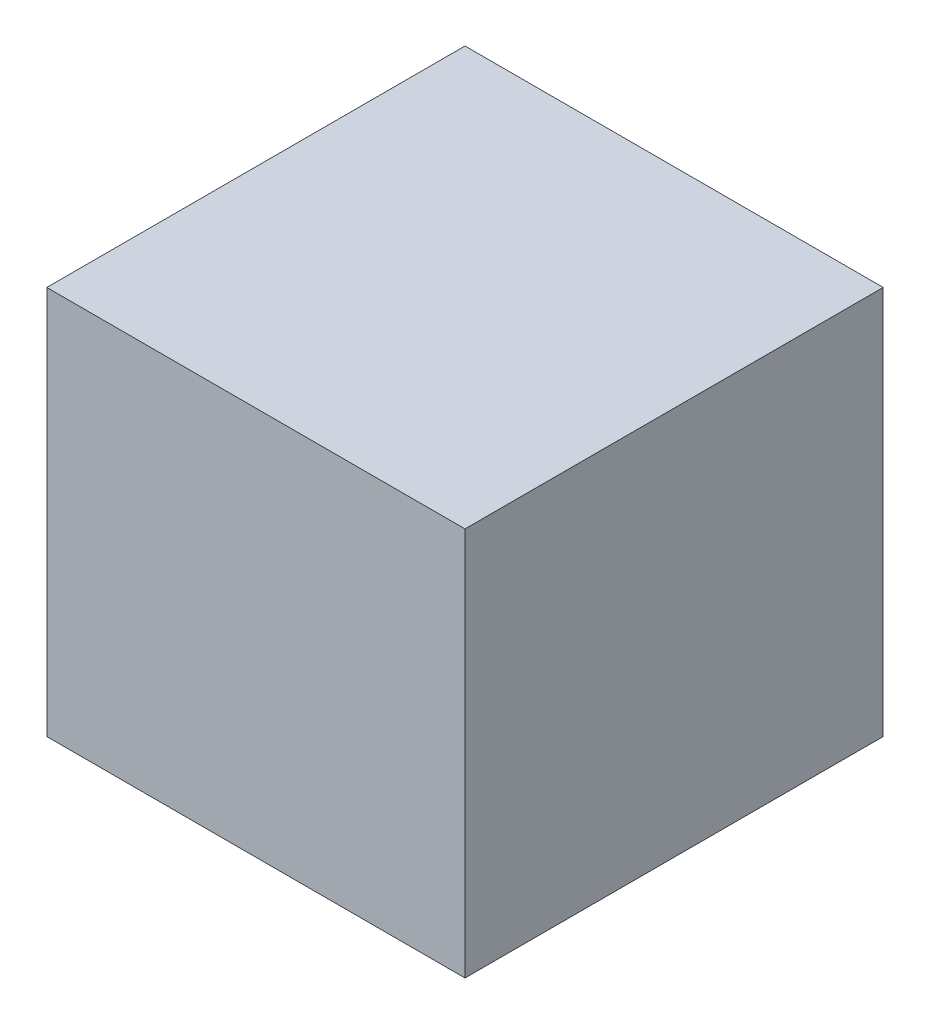
ISO-10303-21;
HEADER;
FILE_DESCRIPTION(('STEP AP214'),'2;1');
FILE_NAME('part.step','',(''),(''),'','','');
FILE_SCHEMA(('AUTOMOTIVE_DESIGN { 1 0 10303 214 1 1 1 1 }'));
ENDSEC;
DATA;
#1=APPLICATION_CONTEXT('core data for automotive mechanical design processes');
#2=APPLICATION_PROTOCOL_DEFINITION('international standard','automotive_design',2000,#1);
#3=PRODUCT_CONTEXT('',#1,'mechanical');
#4=PRODUCT('Part','Part','',(#3));
#5=PRODUCT_RELATED_PRODUCT_CATEGORY('part','',(#4));
#6=PRODUCT_DEFINITION_FORMATION('','',#4);
#7=PRODUCT_DEFINITION_CONTEXT('part definition',#1,'design');
#8=PRODUCT_DEFINITION('design','',#6,#7);
#9=PRODUCT_DEFINITION_SHAPE('','',#8);
#10=(LENGTH_UNIT() NAMED_UNIT(*) SI_UNIT(.MILLI.,.METRE.));
#11=(NAMED_UNIT(*) PLANE_ANGLE_UNIT() SI_UNIT($,.RADIAN.));
#12=(NAMED_UNIT(*) SI_UNIT($,.STERADIAN.) SOLID_ANGLE_UNIT());
#13=UNCERTAINTY_MEASURE_WITH_UNIT(LENGTH_MEASURE(1.E-05),#10,'distance_accuracy_value','');
#14=(GEOMETRIC_REPRESENTATION_CONTEXT(3) GLOBAL_UNCERTAINTY_ASSIGNED_CONTEXT((#13)) GLOBAL_UNIT_ASSIGNED_CONTEXT((#10,
#11,#12)) REPRESENTATION_CONTEXT('',''));
#15=CARTESIAN_POINT('',(0.,0.,0.));
#16=DIRECTION('',(0.,0.,1.));
#17=DIRECTION('',(1.,0.,0.));
#18=AXIS2_PLACEMENT_3D('',#15,#16,#17);
#19=CARTESIAN_POINT('',(0.,3.,0.));
#20=DIRECTION('',(0.,0.,-1.));
#21=DIRECTION('',(-1.,0.,0.));
#22=AXIS2_PLACEMENT_3D('',#19,#20,#21);
#23=PLANE('',#22);
#24=DIRECTION('',(0.,-1.,0.));
#25=VECTOR('',#24,1.);
#26=CARTESIAN_POINT('',(100.,3.,0.));
#27=LINE('',#26,#25);
#28=CARTESIAN_POINT('',(100.,3.,0.));
#29=VERTEX_POINT('',#28);
#30=CARTESIAN_POINT('',(100.,-90.,0.));
#31=VERTEX_POINT('',#30);
#32=EDGE_CURVE('E38',#29,#31,#27,.T.);
#33=ORIENTED_EDGE('',*,*,#32,.T.);
#34=DIRECTION('',(-1.,0.,0.));
#35=VECTOR('',#34,1.);
#36=CARTESIAN_POINT('',(0.,-90.,0.));
#37=LINE('',#36,#35);
#38=CARTESIAN_POINT('',(0.,-90.,0.));
#39=VERTEX_POINT('',#38);
#40=EDGE_CURVE('E148',#31,#39,#37,.T.);
#41=ORIENTED_EDGE('',*,*,#40,.T.);
#42=DIRECTION('',(0.,-1.,0.));
#43=VECTOR('',#42,1.);
#44=CARTESIAN_POINT('',(0.,3.,0.));
#45=LINE('',#44,#43);
#46=CARTESIAN_POINT('',(0.,3.,0.));
#47=VERTEX_POINT('',#46);
#48=EDGE_CURVE('E11',#47,#39,#45,.T.);
#49=ORIENTED_EDGE('',*,*,#48,.F.);
#50=DIRECTION('',(1.,0.,0.));
#51=VECTOR('',#50,1.);
#52=CARTESIAN_POINT('',(0.,3.,0.));
#53=LINE('',#52,#51);
#54=EDGE_CURVE('E150',#47,#29,#53,.T.);
#55=ORIENTED_EDGE('',*,*,#54,.T.);
#56=EDGE_LOOP('',(#33,#41,#49,#55));
#57=FACE_BOUND('',#56,.T.);
#58=ADVANCED_FACE('F35',(#57),#23,.T.);
#59=CARTESIAN_POINT('',(0.,3.,0.));
#60=DIRECTION('',(1.,0.,0.));
#61=DIRECTION('',(0.,0.,-1.));
#62=AXIS2_PLACEMENT_3D('',#59,#60,#61);
#63=PLANE('',#62);
#64=ORIENTED_EDGE('',*,*,#48,.T.);
#65=DIRECTION('',(0.,0.,1.));
#66=VECTOR('',#65,1.);
#67=CARTESIAN_POINT('',(0.,-90.,0.));
#68=LINE('',#67,#66);
#69=CARTESIAN_POINT('',(0.,-90.,100.));
#70=VERTEX_POINT('',#69);
#71=EDGE_CURVE('E136',#39,#70,#68,.T.);
#72=ORIENTED_EDGE('',*,*,#71,.T.);
#73=DIRECTION('',(0.,-1.,0.));
#74=VECTOR('',#73,1.);
#75=CARTESIAN_POINT('',(0.,3.,100.));
#76=LINE('',#75,#74);
#77=CARTESIAN_POINT('',(0.,3.,100.));
#78=VERTEX_POINT('',#77);
#79=EDGE_CURVE('E43',#78,#70,#76,.T.);
#80=ORIENTED_EDGE('',*,*,#79,.F.);
#81=DIRECTION('',(0.,0.,1.));
#82=VECTOR('',#81,1.);
#83=CARTESIAN_POINT('',(0.,3.,0.));
#84=LINE('',#83,#82);
#85=EDGE_CURVE('E157',#47,#78,#84,.T.);
#86=ORIENTED_EDGE('',*,*,#85,.F.);
#87=EDGE_LOOP('',(#64,#72,#80,#86));
#88=FACE_BOUND('',#87,.T.);
#89=ADVANCED_FACE('F171',(#88),#63,.F.);
#90=CARTESIAN_POINT('',(0.,3.,100.));
#91=DIRECTION('',(0.,0.,-1.));
#92=DIRECTION('',(-1.,0.,0.));
#93=AXIS2_PLACEMENT_3D('',#90,#91,#92);
#94=PLANE('',#93);
#95=ORIENTED_EDGE('',*,*,#79,.T.);
#96=DIRECTION('',(1.,0.,0.));
#97=VECTOR('',#96,1.);
#98=CARTESIAN_POINT('',(0.,-90.,100.));
#99=LINE('',#98,#97);
#100=CARTESIAN_POINT('',(100.,-90.,100.));
#101=VERTEX_POINT('',#100);
#102=EDGE_CURVE('E142',#70,#101,#99,.T.);
#103=ORIENTED_EDGE('',*,*,#102,.T.);
#104=DIRECTION('',(0.,-1.,0.));
#105=VECTOR('',#104,1.);
#106=CARTESIAN_POINT('',(100.,3.,100.));
#107=LINE('',#106,#105);
#108=CARTESIAN_POINT('',(100.,3.,100.));
#109=VERTEX_POINT('',#108);
#110=EDGE_CURVE('E159',#109,#101,#107,.T.);
#111=ORIENTED_EDGE('',*,*,#110,.F.);
#112=DIRECTION('',(1.,0.,0.));
#113=VECTOR('',#112,1.);
#114=CARTESIAN_POINT('',(0.,3.,100.));
#115=LINE('',#114,#113);
#116=EDGE_CURVE('E155',#78,#109,#115,.T.);
#117=ORIENTED_EDGE('',*,*,#116,.F.);
#118=EDGE_LOOP('',(#95,#103,#111,#117));
#119=FACE_BOUND('',#118,.T.);
#120=ADVANCED_FACE('F176',(#119),#94,.F.);
#121=CARTESIAN_POINT('',(100.,3.,0.));
#122=DIRECTION('',(1.,0.,0.));
#123=DIRECTION('',(0.,0.,-1.));
#124=AXIS2_PLACEMENT_3D('',#121,#122,#123);
#125=PLANE('',#124);
#126=ORIENTED_EDGE('',*,*,#110,.T.);
#127=DIRECTION('',(0.,0.,-1.));
#128=VECTOR('',#127,1.);
#129=CARTESIAN_POINT('',(100.,-90.,0.));
#130=LINE('',#129,#128);
#131=EDGE_CURVE('E145',#101,#31,#130,.T.);
#132=ORIENTED_EDGE('',*,*,#131,.T.);
#133=ORIENTED_EDGE('',*,*,#32,.F.);
#134=DIRECTION('',(0.,0.,1.));
#135=VECTOR('',#134,1.);
#136=CARTESIAN_POINT('',(100.,3.,0.));
#137=LINE('',#136,#135);
#138=EDGE_CURVE('E152',#29,#109,#137,.T.);
#139=ORIENTED_EDGE('',*,*,#138,.T.);
#140=EDGE_LOOP('',(#126,#132,#133,#139));
#141=FACE_BOUND('',#140,.T.);
#142=ADVANCED_FACE('F166',(#141),#125,.T.);
#143=CARTESIAN_POINT('',(0.,3.,0.));
#144=DIRECTION('',(0.,-1.,0.));
#145=DIRECTION('',(0.,0.,-1.));
#146=AXIS2_PLACEMENT_3D('',#143,#144,#145);
#147=PLANE('',#146);
#148=ORIENTED_EDGE('',*,*,#54,.F.);
#149=ORIENTED_EDGE('',*,*,#85,.T.);
#150=ORIENTED_EDGE('',*,*,#116,.T.);
#151=ORIENTED_EDGE('',*,*,#138,.F.);
#152=EDGE_LOOP('',(#148,#149,#150,#151));
#153=FACE_BOUND('',#152,.T.);
#154=ADVANCED_FACE('F174',(#153),#147,.F.);
#155=CARTESIAN_POINT('',(0.,-90.,0.));
#156=DIRECTION('',(0.,1.,0.));
#157=DIRECTION('',(0.,0.,1.));
#158=AXIS2_PLACEMENT_3D('',#155,#156,#157);
#159=PLANE('',#158);
#160=DIRECTION('',(-1.,0.,0.));
#161=VECTOR('',#160,1.);
#162=CARTESIAN_POINT('',(3.00000000000001,-90.,3.));
#163=LINE('',#162,#161);
#164=CARTESIAN_POINT('',(97.,-90.,3.));
#165=VERTEX_POINT('',#164);
#166=CARTESIAN_POINT('',(3.00000000000001,-90.,3.));
#167=VERTEX_POINT('',#166);
#168=EDGE_CURVE('E108',#165,#167,#163,.T.);
#169=ORIENTED_EDGE('',*,*,#168,.T.);
#170=DIRECTION('',(0.,0.,1.));
#171=VECTOR('',#170,1.);
#172=CARTESIAN_POINT('',(3.00000000000001,-90.,97.));
#173=LINE('',#172,#171);
#174=CARTESIAN_POINT('',(3.00000000000001,-90.,97.));
#175=VERTEX_POINT('',#174);
#176=EDGE_CURVE('E102',#167,#175,#173,.T.);
#177=ORIENTED_EDGE('',*,*,#176,.T.);
#178=DIRECTION('',(1.,0.,0.));
#179=VECTOR('',#178,1.);
#180=CARTESIAN_POINT('',(3.00000000000001,-90.,97.));
#181=LINE('',#180,#179);
#182=CARTESIAN_POINT('',(97.,-90.,97.));
#183=VERTEX_POINT('',#182);
#184=EDGE_CURVE('E112',#175,#183,#181,.T.);
#185=ORIENTED_EDGE('',*,*,#184,.T.);
#186=DIRECTION('',(0.,0.,-1.));
#187=VECTOR('',#186,1.);
#188=CARTESIAN_POINT('',(97.,-90.,97.));
#189=LINE('',#188,#187);
#190=EDGE_CURVE('E116',#183,#165,#189,.T.);
#191=ORIENTED_EDGE('',*,*,#190,.T.);
#192=EDGE_LOOP('',(#169,#177,#185,#191));
#193=FACE_BOUND('',#192,.T.);
#194=ORIENTED_EDGE('',*,*,#71,.F.);
#195=ORIENTED_EDGE('',*,*,#40,.F.);
#196=ORIENTED_EDGE('',*,*,#131,.F.);
#197=ORIENTED_EDGE('',*,*,#102,.F.);
#198=EDGE_LOOP('',(#194,#195,#196,#197));
#199=FACE_BOUND('',#198,.T.);
#200=ADVANCED_FACE('F118',(#193,#199),#159,.F.);
#201=CARTESIAN_POINT('',(3.00000000000001,-90.,97.));
#202=DIRECTION('',(-1.,0.,0.));
#203=DIRECTION('',(0.,0.,1.));
#204=AXIS2_PLACEMENT_3D('',#201,#202,#203);
#205=PLANE('',#204);
#206=DIRECTION('',(0.,0.,1.));
#207=VECTOR('',#206,1.);
#208=CARTESIAN_POINT('',(3.00000000000001,0.,97.));
#209=LINE('',#208,#207);
#210=CARTESIAN_POINT('',(3.00000000000001,0.,3.));
#211=VERTEX_POINT('',#210);
#212=CARTESIAN_POINT('',(3.00000000000001,0.,97.));
#213=VERTEX_POINT('',#212);
#214=EDGE_CURVE('E105',#211,#213,#209,.T.);
#215=ORIENTED_EDGE('',*,*,#214,.T.);
#216=DIRECTION('',(0.,1.,0.));
#217=VECTOR('',#216,1.);
#218=CARTESIAN_POINT('',(3.00000000000001,-90.,97.));
#219=LINE('',#218,#217);
#220=EDGE_CURVE('E51',#175,#213,#219,.T.);
#221=ORIENTED_EDGE('',*,*,#220,.F.);
#222=ORIENTED_EDGE('',*,*,#176,.F.);
#223=DIRECTION('',(0.,1.,0.));
#224=VECTOR('',#223,1.);
#225=CARTESIAN_POINT('',(3.00000000000001,-90.,3.));
#226=LINE('',#225,#224);
#227=EDGE_CURVE('E134',#167,#211,#226,.T.);
#228=ORIENTED_EDGE('',*,*,#227,.T.);
#229=EDGE_LOOP('',(#215,#221,#222,#228));
#230=FACE_BOUND('',#229,.T.);
#231=ADVANCED_FACE('F100',(#230),#205,.F.);
#232=CARTESIAN_POINT('',(3.00000000000001,-90.,3.));
#233=DIRECTION('',(0.,0.,-1.));
#234=DIRECTION('',(-1.,0.,0.));
#235=AXIS2_PLACEMENT_3D('',#232,#233,#234);
#236=PLANE('',#235);
#237=DIRECTION('',(-1.,0.,0.));
#238=VECTOR('',#237,1.);
#239=CARTESIAN_POINT('',(3.00000000000001,0.,3.));
#240=LINE('',#239,#238);
#241=CARTESIAN_POINT('',(97.,0.,3.));
#242=VERTEX_POINT('',#241);
#243=EDGE_CURVE('E121',#242,#211,#240,.T.);
#244=ORIENTED_EDGE('',*,*,#243,.T.);
#245=ORIENTED_EDGE('',*,*,#227,.F.);
#246=ORIENTED_EDGE('',*,*,#168,.F.);
#247=DIRECTION('',(0.,1.,0.));
#248=VECTOR('',#247,1.);
#249=CARTESIAN_POINT('',(97.,-90.,3.));
#250=LINE('',#249,#248);
#251=EDGE_CURVE('E137',#165,#242,#250,.T.);
#252=ORIENTED_EDGE('',*,*,#251,.T.);
#253=EDGE_LOOP('',(#244,#245,#246,#252));
#254=FACE_BOUND('',#253,.T.);
#255=ADVANCED_FACE('F223',(#254),#236,.F.);
#256=CARTESIAN_POINT('',(97.,-90.,97.));
#257=DIRECTION('',(1.,0.,0.));
#258=DIRECTION('',(0.,0.,-1.));
#259=AXIS2_PLACEMENT_3D('',#256,#257,#258);
#260=PLANE('',#259);
#261=DIRECTION('',(0.,0.,-1.));
#262=VECTOR('',#261,1.);
#263=CARTESIAN_POINT('',(97.,0.,97.));
#264=LINE('',#263,#262);
#265=CARTESIAN_POINT('',(97.,0.,97.));
#266=VERTEX_POINT('',#265);
#267=EDGE_CURVE('E124',#266,#242,#264,.T.);
#268=ORIENTED_EDGE('',*,*,#267,.T.);
#269=ORIENTED_EDGE('',*,*,#251,.F.);
#270=ORIENTED_EDGE('',*,*,#190,.F.);
#271=DIRECTION('',(0.,1.,0.));
#272=VECTOR('',#271,1.);
#273=CARTESIAN_POINT('',(97.,-90.,97.));
#274=LINE('',#273,#272);
#275=EDGE_CURVE('E107',#183,#266,#274,.T.);
#276=ORIENTED_EDGE('',*,*,#275,.T.);
#277=EDGE_LOOP('',(#268,#269,#270,#276));
#278=FACE_BOUND('',#277,.T.);
#279=ADVANCED_FACE('F232',(#278),#260,.F.);
#280=CARTESIAN_POINT('',(3.00000000000001,-90.,97.));
#281=DIRECTION('',(0.,0.,1.));
#282=DIRECTION('',(1.,0.,0.));
#283=AXIS2_PLACEMENT_3D('',#280,#281,#282);
#284=PLANE('',#283);
#285=DIRECTION('',(1.,0.,0.));
#286=VECTOR('',#285,1.);
#287=CARTESIAN_POINT('',(3.00000000000001,0.,97.));
#288=LINE('',#287,#286);
#289=EDGE_CURVE('E130',#213,#266,#288,.T.);
#290=ORIENTED_EDGE('',*,*,#289,.T.);
#291=ORIENTED_EDGE('',*,*,#275,.F.);
#292=ORIENTED_EDGE('',*,*,#184,.F.);
#293=ORIENTED_EDGE('',*,*,#220,.T.);
#294=EDGE_LOOP('',(#290,#291,#292,#293));
#295=FACE_BOUND('',#294,.T.);
#296=ADVANCED_FACE('F113',(#295),#284,.F.);
#297=CARTESIAN_POINT('',(0.,0.,0.));
#298=DIRECTION('',(0.,-1.,0.));
#299=DIRECTION('',(0.,0.,-1.));
#300=AXIS2_PLACEMENT_3D('',#297,#298,#299);
#301=PLANE('',#300);
#302=ORIENTED_EDGE('',*,*,#289,.F.);
#303=ORIENTED_EDGE('',*,*,#214,.F.);
#304=ORIENTED_EDGE('',*,*,#243,.F.);
#305=ORIENTED_EDGE('',*,*,#267,.F.);
#306=EDGE_LOOP('',(#302,#303,#304,#305));
#307=FACE_BOUND('',#306,.T.);
#308=ADVANCED_FACE('F251',(#307),#301,.T.);
#309=CLOSED_SHELL('',(#58,#89,#120,#142,#154,#200,#231,#255,#279,#296,#308));
#310=MANIFOLD_SOLID_BREP('B2',#309);
#311=ADVANCED_BREP_SHAPE_REPRESENTATION('',(#18,#310),#14);
#312=SHAPE_DEFINITION_REPRESENTATION(#9,#311);
ENDSEC;
END-ISO-10303-21;
